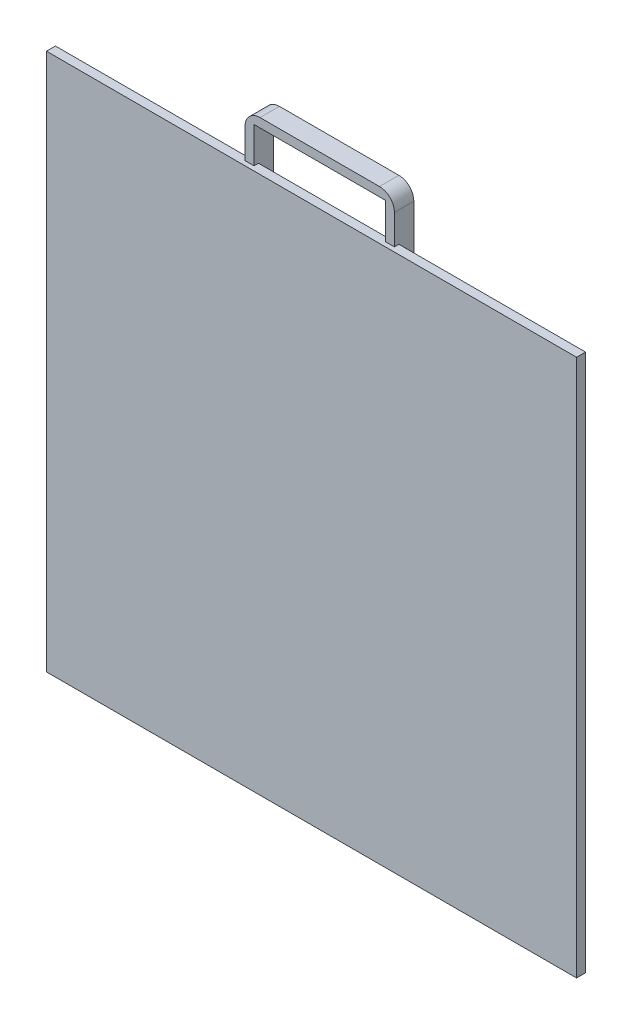
ISO-10303-21;
HEADER;
FILE_DESCRIPTION(('STEP AP214'),'2;1');
FILE_NAME('part.step','',(''),(''),'','','');
FILE_SCHEMA(('AUTOMOTIVE_DESIGN { 1 0 10303 214 1 1 1 1 }'));
ENDSEC;
DATA;
#1=APPLICATION_CONTEXT('core data for automotive mechanical design processes');
#2=APPLICATION_PROTOCOL_DEFINITION('international standard','automotive_design',2000,#1);
#3=PRODUCT_CONTEXT('',#1,'mechanical');
#4=PRODUCT('Part','Part','',(#3));
#5=PRODUCT_RELATED_PRODUCT_CATEGORY('part','',(#4));
#6=PRODUCT_DEFINITION_FORMATION('','',#4);
#7=PRODUCT_DEFINITION_CONTEXT('part definition',#1,'design');
#8=PRODUCT_DEFINITION('design','',#6,#7);
#9=PRODUCT_DEFINITION_SHAPE('','',#8);
#10=(LENGTH_UNIT() NAMED_UNIT(*) SI_UNIT(.MILLI.,.METRE.));
#11=(NAMED_UNIT(*) PLANE_ANGLE_UNIT() SI_UNIT($,.RADIAN.));
#12=(NAMED_UNIT(*) SI_UNIT($,.STERADIAN.) SOLID_ANGLE_UNIT());
#13=UNCERTAINTY_MEASURE_WITH_UNIT(LENGTH_MEASURE(1.E-05),#10,'distance_accuracy_value','');
#14=(GEOMETRIC_REPRESENTATION_CONTEXT(3) GLOBAL_UNCERTAINTY_ASSIGNED_CONTEXT((#13)) GLOBAL_UNIT_ASSIGNED_CONTEXT((#10,
#11,#12)) REPRESENTATION_CONTEXT('',''));
#15=CARTESIAN_POINT('',(0.,0.,0.));
#16=DIRECTION('',(0.,0.,1.));
#17=DIRECTION('',(1.,0.,0.));
#18=AXIS2_PLACEMENT_3D('',#15,#16,#17);
#19=CARTESIAN_POINT('',(0.,165.,-8.));
#20=DIRECTION('',(0.,1.,0.));
#21=DIRECTION('',(0.,0.,1.));
#22=AXIS2_PLACEMENT_3D('',#19,#20,#21);
#23=PLANE('',#22);
#24=DIRECTION('',(-1.,0.,0.));
#25=VECTOR('',#24,1.);
#26=CARTESIAN_POINT('',(0.,165.,-8.));
#27=LINE('',#26,#25);
#28=CARTESIAN_POINT('',(67.9999999999999,165.,-8.));
#29=VERTEX_POINT('',#28);
#30=CARTESIAN_POINT('',(65.,165.,-8.));
#31=VERTEX_POINT('',#30);
#32=EDGE_CURVE('E211',#29,#31,#27,.T.);
#33=ORIENTED_EDGE('',*,*,#32,.F.);
#34=DIRECTION('',(0.,0.,-1.));
#35=VECTOR('',#34,1.);
#36=CARTESIAN_POINT('',(67.9999999999999,165.,48.6236379965612));
#37=LINE('',#36,#35);
#38=CARTESIAN_POINT('',(67.9999999999999,165.,-3.));
#39=VERTEX_POINT('',#38);
#40=EDGE_CURVE('E197',#39,#29,#37,.T.);
#41=ORIENTED_EDGE('',*,*,#40,.F.);
#42=DIRECTION('',(1.,0.,0.));
#43=VECTOR('',#42,1.);
#44=CARTESIAN_POINT('',(0.,165.,-3.));
#45=LINE('',#44,#43);
#46=CARTESIAN_POINT('',(65.,165.,-3.));
#47=VERTEX_POINT('',#46);
#48=EDGE_CURVE('E272',#47,#39,#45,.T.);
#49=ORIENTED_EDGE('',*,*,#48,.F.);
#50=DIRECTION('',(0.,0.,1.));
#51=VECTOR('',#50,1.);
#52=CARTESIAN_POINT('',(65.,165.,-8.));
#53=LINE('',#52,#51);
#54=EDGE_CURVE('E222',#31,#47,#53,.T.);
#55=ORIENTED_EDGE('',*,*,#54,.F.);
#56=EDGE_LOOP('',(#33,#41,#49,#55));
#57=FACE_BOUND('',#56,.T.);
#58=ADVANCED_FACE('F34',(#57),#23,.F.);
#59=CARTESIAN_POINT('',(0.,180.,-3.));
#60=DIRECTION('',(0.,1.,0.));
#61=DIRECTION('',(0.,0.,1.));
#62=AXIS2_PLACEMENT_3D('',#59,#60,#61);
#63=PLANE('',#62);
#64=DIRECTION('',(1.,0.,0.));
#65=VECTOR('',#64,1.);
#66=CARTESIAN_POINT('',(0.,180.,-1.5));
#67=LINE('',#66,#65);
#68=CARTESIAN_POINT('',(65.,180.,-1.5));
#69=VERTEX_POINT('',#68);
#70=CARTESIAN_POINT('',(68.,180.,-1.5));
#71=VERTEX_POINT('',#70);
#72=EDGE_CURVE('E182',#69,#71,#67,.T.);
#73=ORIENTED_EDGE('',*,*,#72,.F.);
#74=DIRECTION('',(0.,0.,-1.));
#75=VECTOR('',#74,1.);
#76=CARTESIAN_POINT('',(65.,180.,-3.));
#77=LINE('',#76,#75);
#78=CARTESIAN_POINT('',(65.,180.,-3.));
#79=VERTEX_POINT('',#78);
#80=EDGE_CURVE('E235',#69,#79,#77,.T.);
#81=ORIENTED_EDGE('',*,*,#80,.T.);
#82=DIRECTION('',(-1.,0.,0.));
#83=VECTOR('',#82,1.);
#84=CARTESIAN_POINT('',(0.,180.,-3.));
#85=LINE('',#84,#83);
#86=CARTESIAN_POINT('',(0.,180.,-3.));
#87=VERTEX_POINT('',#86);
#88=EDGE_CURVE('E249',#79,#87,#85,.T.);
#89=ORIENTED_EDGE('',*,*,#88,.T.);
#90=DIRECTION('',(0.,0.,1.));
#91=VECTOR('',#90,1.);
#92=CARTESIAN_POINT('',(0.,180.,-3.));
#93=LINE('',#92,#91);
#94=CARTESIAN_POINT('',(0.,180.,0.));
#95=VERTEX_POINT('',#94);
#96=EDGE_CURVE('E264',#87,#95,#93,.T.);
#97=ORIENTED_EDGE('',*,*,#96,.T.);
#98=DIRECTION('',(-1.,0.,0.));
#99=VECTOR('',#98,1.);
#100=CARTESIAN_POINT('',(0.,180.,0.));
#101=LINE('',#100,#99);
#102=CARTESIAN_POINT('',(177.5,180.,0.));
#103=VERTEX_POINT('',#102);
#104=EDGE_CURVE('E243',#103,#95,#101,.T.);
#105=ORIENTED_EDGE('',*,*,#104,.F.);
#106=DIRECTION('',(0.,0.,1.));
#107=VECTOR('',#106,1.);
#108=CARTESIAN_POINT('',(177.5,180.,-3.));
#109=LINE('',#108,#107);
#110=CARTESIAN_POINT('',(177.5,180.,-3.));
#111=VERTEX_POINT('',#110);
#112=EDGE_CURVE('E267',#111,#103,#109,.T.);
#113=ORIENTED_EDGE('',*,*,#112,.F.);
#114=CARTESIAN_POINT('',(115.,180.,-3.));
#115=VERTEX_POINT('',#114);
#116=EDGE_CURVE('E250',#111,#115,#85,.T.);
#117=ORIENTED_EDGE('',*,*,#116,.T.);
#118=DIRECTION('',(0.,0.,-1.));
#119=VECTOR('',#118,1.);
#120=CARTESIAN_POINT('',(115.,180.,-3.));
#121=LINE('',#120,#119);
#122=CARTESIAN_POINT('',(115.,180.,-1.5));
#123=VERTEX_POINT('',#122);
#124=EDGE_CURVE('E231',#123,#115,#121,.T.);
#125=ORIENTED_EDGE('',*,*,#124,.F.);
#126=CARTESIAN_POINT('',(112.,180.,-1.5));
#127=VERTEX_POINT('',#126);
#128=EDGE_CURVE('E281',#127,#123,#67,.T.);
#129=ORIENTED_EDGE('',*,*,#128,.F.);
#130=DIRECTION('',(0.,0.,1.));
#131=VECTOR('',#130,1.);
#132=CARTESIAN_POINT('',(112.,180.,-8.));
#133=LINE('',#132,#131);
#134=CARTESIAN_POINT('',(112.,180.,-3.));
#135=VERTEX_POINT('',#134);
#136=EDGE_CURVE('E185',#135,#127,#133,.T.);
#137=ORIENTED_EDGE('',*,*,#136,.F.);
#138=DIRECTION('',(-1.,0.,0.));
#139=VECTOR('',#138,1.);
#140=CARTESIAN_POINT('',(0.,180.,-3.));
#141=LINE('',#140,#139);
#142=CARTESIAN_POINT('',(68.,180.,-3.));
#143=VERTEX_POINT('',#142);
#144=EDGE_CURVE('E189',#135,#143,#141,.T.);
#145=ORIENTED_EDGE('',*,*,#144,.T.);
#146=DIRECTION('',(0.,0.,1.));
#147=VECTOR('',#146,1.);
#148=CARTESIAN_POINT('',(68.,180.,-8.));
#149=LINE('',#148,#147);
#150=EDGE_CURVE('E183',#143,#71,#149,.T.);
#151=ORIENTED_EDGE('',*,*,#150,.T.);
#152=EDGE_LOOP('',(#73,#81,#89,#97,#105,#113,#117,#125,#129,#137,#145,#151));
#153=FACE_BOUND('',#152,.T.);
#154=ADVANCED_FACE('F321',(#153),#63,.T.);
#155=CARTESIAN_POINT('',(0.,0.,-3.));
#156=DIRECTION('',(0.,0.,-1.));
#157=DIRECTION('',(-1.,0.,0.));
#158=AXIS2_PLACEMENT_3D('',#155,#156,#157);
#159=PLANE('',#158);
#160=ORIENTED_EDGE('',*,*,#144,.F.);
#161=DIRECTION('',(0.,1.,0.));
#162=VECTOR('',#161,1.);
#163=CARTESIAN_POINT('',(112.,168.,-3.));
#164=LINE('',#163,#162);
#165=CARTESIAN_POINT('',(112.,165.,-3.));
#166=VERTEX_POINT('',#165);
#167=EDGE_CURVE('E193',#166,#135,#164,.T.);
#168=ORIENTED_EDGE('',*,*,#167,.F.);
#169=CARTESIAN_POINT('',(115.,165.,-3.));
#170=VERTEX_POINT('',#169);
#171=EDGE_CURVE('E266',#166,#170,#45,.T.);
#172=ORIENTED_EDGE('',*,*,#171,.T.);
#173=DIRECTION('',(0.,-1.,0.));
#174=VECTOR('',#173,1.);
#175=CARTESIAN_POINT('',(115.,0.,-3.));
#176=LINE('',#175,#174);
#177=EDGE_CURVE('E275',#115,#170,#176,.T.);
#178=ORIENTED_EDGE('',*,*,#177,.F.);
#179=ORIENTED_EDGE('',*,*,#116,.F.);
#180=DIRECTION('',(0.,1.,0.));
#181=VECTOR('',#180,1.);
#182=CARTESIAN_POINT('',(177.5,0.,-3.));
#183=LINE('',#182,#181);
#184=CARTESIAN_POINT('',(177.5,0.,-3.));
#185=VERTEX_POINT('',#184);
#186=EDGE_CURVE('E246',#185,#111,#183,.T.);
#187=ORIENTED_EDGE('',*,*,#186,.F.);
#188=DIRECTION('',(1.,0.,0.));
#189=VECTOR('',#188,1.);
#190=CARTESIAN_POINT('',(0.,0.,-3.));
#191=LINE('',#190,#189);
#192=CARTESIAN_POINT('',(0.,0.,-3.));
#193=VERTEX_POINT('',#192);
#194=EDGE_CURVE('E242',#193,#185,#191,.T.);
#195=ORIENTED_EDGE('',*,*,#194,.F.);
#196=DIRECTION('',(0.,-1.,0.));
#197=VECTOR('',#196,1.);
#198=CARTESIAN_POINT('',(0.,0.,-3.));
#199=LINE('',#198,#197);
#200=EDGE_CURVE('E239',#87,#193,#199,.T.);
#201=ORIENTED_EDGE('',*,*,#200,.F.);
#202=ORIENTED_EDGE('',*,*,#88,.F.);
#203=DIRECTION('',(0.,-1.,0.));
#204=VECTOR('',#203,1.);
#205=CARTESIAN_POINT('',(65.,0.,-3.));
#206=LINE('',#205,#204);
#207=EDGE_CURVE('E278',#79,#47,#206,.T.);
#208=ORIENTED_EDGE('',*,*,#207,.T.);
#209=ORIENTED_EDGE('',*,*,#48,.T.);
#210=DIRECTION('',(0.,-1.,0.));
#211=VECTOR('',#210,1.);
#212=CARTESIAN_POINT('',(67.9999999999999,168.,-3.));
#213=LINE('',#212,#211);
#214=EDGE_CURVE('E196',#143,#39,#213,.T.);
#215=ORIENTED_EDGE('',*,*,#214,.F.);
#216=EDGE_LOOP('',(#160,#168,#172,#178,#179,#187,#195,#201,#202,#208,#209,#215));
#217=FACE_BOUND('',#216,.T.);
#218=ADVANCED_FACE('F328',(#217),#159,.T.);
#219=CARTESIAN_POINT('',(0.,0.,-3.));
#220=DIRECTION('',(-1.,0.,0.));
#221=DIRECTION('',(0.,0.,1.));
#222=AXIS2_PLACEMENT_3D('',#219,#220,#221);
#223=PLANE('',#222);
#224=DIRECTION('',(0.,-1.,0.));
#225=VECTOR('',#224,1.);
#226=CARTESIAN_POINT('',(0.,0.,0.));
#227=LINE('',#226,#225);
#228=CARTESIAN_POINT('',(0.,0.,0.));
#229=VERTEX_POINT('',#228);
#230=EDGE_CURVE('E238',#95,#229,#227,.T.);
#231=ORIENTED_EDGE('',*,*,#230,.F.);
#232=ORIENTED_EDGE('',*,*,#96,.F.);
#233=ORIENTED_EDGE('',*,*,#200,.T.);
#234=DIRECTION('',(0.,0.,1.));
#235=VECTOR('',#234,1.);
#236=CARTESIAN_POINT('',(0.,0.,-3.));
#237=LINE('',#236,#235);
#238=EDGE_CURVE('E253',#193,#229,#237,.T.);
#239=ORIENTED_EDGE('',*,*,#238,.T.);
#240=EDGE_LOOP('',(#231,#232,#233,#239));
#241=FACE_BOUND('',#240,.T.);
#242=ADVANCED_FACE('F365',(#241),#223,.T.);
#243=CARTESIAN_POINT('',(177.5,0.,-3.));
#244=DIRECTION('',(1.,0.,0.));
#245=DIRECTION('',(0.,0.,-1.));
#246=AXIS2_PLACEMENT_3D('',#243,#244,#245);
#247=PLANE('',#246);
#248=DIRECTION('',(0.,1.,0.));
#249=VECTOR('',#248,1.);
#250=CARTESIAN_POINT('',(177.5,0.,0.));
#251=LINE('',#250,#249);
#252=CARTESIAN_POINT('',(177.5,0.,0.));
#253=VERTEX_POINT('',#252);
#254=EDGE_CURVE('E259',#253,#103,#251,.T.);
#255=ORIENTED_EDGE('',*,*,#254,.F.);
#256=DIRECTION('',(0.,0.,1.));
#257=VECTOR('',#256,1.);
#258=CARTESIAN_POINT('',(177.5,0.,-3.));
#259=LINE('',#258,#257);
#260=EDGE_CURVE('E269',#185,#253,#259,.T.);
#261=ORIENTED_EDGE('',*,*,#260,.F.);
#262=ORIENTED_EDGE('',*,*,#186,.T.);
#263=ORIENTED_EDGE('',*,*,#112,.T.);
#264=EDGE_LOOP('',(#255,#261,#262,#263));
#265=FACE_BOUND('',#264,.T.);
#266=ADVANCED_FACE('F367',(#265),#247,.T.);
#267=CARTESIAN_POINT('',(0.,0.,-3.));
#268=DIRECTION('',(0.,-1.,0.));
#269=DIRECTION('',(0.,0.,-1.));
#270=AXIS2_PLACEMENT_3D('',#267,#268,#269);
#271=PLANE('',#270);
#272=DIRECTION('',(1.,0.,0.));
#273=VECTOR('',#272,1.);
#274=CARTESIAN_POINT('',(0.,0.,0.));
#275=LINE('',#274,#273);
#276=EDGE_CURVE('E256',#229,#253,#275,.T.);
#277=ORIENTED_EDGE('',*,*,#276,.F.);
#278=ORIENTED_EDGE('',*,*,#238,.F.);
#279=ORIENTED_EDGE('',*,*,#194,.T.);
#280=ORIENTED_EDGE('',*,*,#260,.T.);
#281=EDGE_LOOP('',(#277,#278,#279,#280));
#282=FACE_BOUND('',#281,.T.);
#283=ADVANCED_FACE('F360',(#282),#271,.T.);
#284=CARTESIAN_POINT('',(0.,0.,0.));
#285=DIRECTION('',(0.,0.,-1.));
#286=DIRECTION('',(-1.,0.,0.));
#287=AXIS2_PLACEMENT_3D('',#284,#285,#286);
#288=PLANE('',#287);
#289=ORIENTED_EDGE('',*,*,#230,.T.);
#290=ORIENTED_EDGE('',*,*,#276,.T.);
#291=ORIENTED_EDGE('',*,*,#254,.T.);
#292=ORIENTED_EDGE('',*,*,#104,.T.);
#293=EDGE_LOOP('',(#289,#290,#291,#292));
#294=FACE_BOUND('',#293,.T.);
#295=ADVANCED_FACE('F354',(#294),#288,.F.);
#296=CARTESIAN_POINT('',(65.,0.,-8.));
#297=DIRECTION('',(1.,0.,0.));
#298=DIRECTION('',(0.,0.,-1.));
#299=AXIS2_PLACEMENT_3D('',#296,#297,#298);
#300=PLANE('',#299);
#301=DIRECTION('',(0.,1.,0.));
#302=VECTOR('',#301,1.);
#303=CARTESIAN_POINT('',(65.,0.,-1.5));
#304=LINE('',#303,#302);
#305=CARTESIAN_POINT('',(65.,190.,-1.5));
#306=VERTEX_POINT('',#305);
#307=EDGE_CURVE('E199',#69,#306,#304,.T.);
#308=ORIENTED_EDGE('',*,*,#307,.T.);
#309=DIRECTION('',(0.,0.,1.));
#310=VECTOR('',#309,1.);
#311=CARTESIAN_POINT('',(65.,190.,-8.));
#312=LINE('',#311,#310);
#313=CARTESIAN_POINT('',(65.,190.,-8.));
#314=VERTEX_POINT('',#313);
#315=EDGE_CURVE('E42',#306,#314,#312,.F.);
#316=ORIENTED_EDGE('',*,*,#315,.T.);
#317=DIRECTION('',(0.,1.,0.));
#318=VECTOR('',#317,1.);
#319=CARTESIAN_POINT('',(65.,0.,-8.));
#320=LINE('',#319,#318);
#321=EDGE_CURVE('E209',#31,#314,#320,.T.);
#322=ORIENTED_EDGE('',*,*,#321,.F.);
#323=ORIENTED_EDGE('',*,*,#54,.T.);
#324=ORIENTED_EDGE('',*,*,#207,.F.);
#325=ORIENTED_EDGE('',*,*,#80,.F.);
#326=EDGE_LOOP('',(#308,#316,#322,#323,#324,#325));
#327=FACE_BOUND('',#326,.T.);
#328=ADVANCED_FACE('F352',(#327),#300,.F.);
#329=CARTESIAN_POINT('',(0.,195.,-8.));
#330=DIRECTION('',(0.,1.,0.));
#331=DIRECTION('',(0.,0.,1.));
#332=AXIS2_PLACEMENT_3D('',#329,#330,#331);
#333=PLANE('',#332);
#334=DIRECTION('',(-1.,0.,0.));
#335=VECTOR('',#334,1.);
#336=CARTESIAN_POINT('',(0.,195.,-8.));
#337=LINE('',#336,#335);
#338=CARTESIAN_POINT('',(110.,195.,-8.));
#339=VERTEX_POINT('',#338);
#340=CARTESIAN_POINT('',(70.,195.,-8.));
#341=VERTEX_POINT('',#340);
#342=EDGE_CURVE('E219',#339,#341,#337,.T.);
#343=ORIENTED_EDGE('',*,*,#342,.T.);
#344=DIRECTION('',(0.,0.,1.));
#345=VECTOR('',#344,1.);
#346=CARTESIAN_POINT('',(70.,195.,-1.5));
#347=LINE('',#346,#345);
#348=CARTESIAN_POINT('',(70.,195.,-1.5));
#349=VERTEX_POINT('',#348);
#350=EDGE_CURVE('E292',#341,#349,#347,.T.);
#351=ORIENTED_EDGE('',*,*,#350,.T.);
#352=DIRECTION('',(-1.,0.,0.));
#353=VECTOR('',#352,1.);
#354=CARTESIAN_POINT('',(0.,195.,-1.5));
#355=LINE('',#354,#353);
#356=CARTESIAN_POINT('',(110.,195.,-1.5));
#357=VERTEX_POINT('',#356);
#358=EDGE_CURVE('E212',#357,#349,#355,.T.);
#359=ORIENTED_EDGE('',*,*,#358,.F.);
#360=DIRECTION('',(0.,0.,1.));
#361=VECTOR('',#360,1.);
#362=CARTESIAN_POINT('',(110.,195.,-8.));
#363=LINE('',#362,#361);
#364=EDGE_CURVE('E288',#357,#339,#363,.F.);
#365=ORIENTED_EDGE('',*,*,#364,.T.);
#366=EDGE_LOOP('',(#343,#351,#359,#365));
#367=FACE_BOUND('',#366,.T.);
#368=ADVANCED_FACE('F298',(#367),#333,.T.);
#369=CARTESIAN_POINT('',(115.,0.,-8.));
#370=DIRECTION('',(1.,0.,0.));
#371=DIRECTION('',(0.,0.,-1.));
#372=AXIS2_PLACEMENT_3D('',#369,#370,#371);
#373=PLANE('',#372);
#374=DIRECTION('',(0.,1.,0.));
#375=VECTOR('',#374,1.);
#376=CARTESIAN_POINT('',(115.,0.,-8.));
#377=LINE('',#376,#375);
#378=CARTESIAN_POINT('',(115.,165.,-8.));
#379=VERTEX_POINT('',#378);
#380=CARTESIAN_POINT('',(115.,190.,-8.));
#381=VERTEX_POINT('',#380);
#382=EDGE_CURVE('E216',#379,#381,#377,.T.);
#383=ORIENTED_EDGE('',*,*,#382,.T.);
#384=DIRECTION('',(0.,0.,1.));
#385=VECTOR('',#384,1.);
#386=CARTESIAN_POINT('',(115.,190.,-8.));
#387=LINE('',#386,#385);
#388=CARTESIAN_POINT('',(115.,190.,-1.5));
#389=VERTEX_POINT('',#388);
#390=EDGE_CURVE('E283',#381,#389,#387,.T.);
#391=ORIENTED_EDGE('',*,*,#390,.T.);
#392=DIRECTION('',(0.,1.,0.));
#393=VECTOR('',#392,1.);
#394=CARTESIAN_POINT('',(115.,0.,-1.5));
#395=LINE('',#394,#393);
#396=EDGE_CURVE('E224',#123,#389,#395,.T.);
#397=ORIENTED_EDGE('',*,*,#396,.F.);
#398=ORIENTED_EDGE('',*,*,#124,.T.);
#399=ORIENTED_EDGE('',*,*,#177,.T.);
#400=DIRECTION('',(0.,0.,1.));
#401=VECTOR('',#400,1.);
#402=CARTESIAN_POINT('',(115.,165.,-8.));
#403=LINE('',#402,#401);
#404=EDGE_CURVE('E228',#379,#170,#403,.T.);
#405=ORIENTED_EDGE('',*,*,#404,.F.);
#406=EDGE_LOOP('',(#383,#391,#397,#398,#399,#405));
#407=FACE_BOUND('',#406,.T.);
#408=ADVANCED_FACE('F309',(#407),#373,.T.);
#409=ORIENTED_EDGE('',*,*,#171,.F.);
#410=DIRECTION('',(0.,0.,-1.));
#411=VECTOR('',#410,1.);
#412=CARTESIAN_POINT('',(112.,165.,48.6236379965612));
#413=LINE('',#412,#411);
#414=CARTESIAN_POINT('',(112.,165.,-8.));
#415=VERTEX_POINT('',#414);
#416=EDGE_CURVE('E205',#166,#415,#413,.T.);
#417=ORIENTED_EDGE('',*,*,#416,.T.);
#418=EDGE_CURVE('E213',#379,#415,#27,.T.);
#419=ORIENTED_EDGE('',*,*,#418,.F.);
#420=ORIENTED_EDGE('',*,*,#404,.T.);
#421=EDGE_LOOP('',(#409,#417,#419,#420));
#422=FACE_BOUND('',#421,.T.);
#423=ADVANCED_FACE('F324',(#422),#23,.F.);
#424=CARTESIAN_POINT('',(0.,0.,-8.));
#425=DIRECTION('',(0.,0.,1.));
#426=DIRECTION('',(1.,0.,0.));
#427=AXIS2_PLACEMENT_3D('',#424,#425,#426);
#428=PLANE('',#427);
#429=ORIENTED_EDGE('',*,*,#321,.T.);
#430=CARTESIAN_POINT('',(70.,190.,-8.));
#431=DIRECTION('',(0.,0.,1.));
#432=DIRECTION('',(1.,0.,0.));
#433=AXIS2_PLACEMENT_3D('',#430,#431,#432);
#434=CIRCLE('',#433,5.);
#435=EDGE_CURVE('E11',#314,#341,#434,.F.);
#436=ORIENTED_EDGE('',*,*,#435,.T.);
#437=ORIENTED_EDGE('',*,*,#342,.F.);
#438=CARTESIAN_POINT('',(110.,190.,-8.));
#439=DIRECTION('',(0.,0.,1.));
#440=DIRECTION('',(1.,0.,0.));
#441=AXIS2_PLACEMENT_3D('',#438,#439,#440);
#442=CIRCLE('',#441,5.);
#443=EDGE_CURVE('E290',#339,#381,#442,.F.);
#444=ORIENTED_EDGE('',*,*,#443,.T.);
#445=ORIENTED_EDGE('',*,*,#382,.F.);
#446=ORIENTED_EDGE('',*,*,#418,.T.);
#447=DIRECTION('',(0.,-1.,0.));
#448=VECTOR('',#447,1.);
#449=CARTESIAN_POINT('',(112.,168.,-8.));
#450=LINE('',#449,#448);
#451=CARTESIAN_POINT('',(112.,192.,-8.));
#452=VERTEX_POINT('',#451);
#453=EDGE_CURVE('E201',#452,#415,#450,.T.);
#454=ORIENTED_EDGE('',*,*,#453,.F.);
#455=DIRECTION('',(1.,0.,0.));
#456=VECTOR('',#455,1.);
#457=CARTESIAN_POINT('',(112.,192.,-8.));
#458=LINE('',#457,#456);
#459=CARTESIAN_POINT('',(67.9999999999999,192.,-8.));
#460=VERTEX_POINT('',#459);
#461=EDGE_CURVE('E192',#460,#452,#458,.T.);
#462=ORIENTED_EDGE('',*,*,#461,.F.);
#463=DIRECTION('',(0.,1.,0.));
#464=VECTOR('',#463,1.);
#465=CARTESIAN_POINT('',(67.9999999999999,168.,-8.));
#466=LINE('',#465,#464);
#467=EDGE_CURVE('E167',#29,#460,#466,.T.);
#468=ORIENTED_EDGE('',*,*,#467,.F.);
#469=ORIENTED_EDGE('',*,*,#32,.T.);
#470=EDGE_LOOP('',(#429,#436,#437,#444,#445,#446,#454,#462,#468,#469));
#471=FACE_BOUND('',#470,.T.);
#472=ADVANCED_FACE('F314',(#471),#428,.F.);
#473=CARTESIAN_POINT('',(0.,0.,-1.5));
#474=DIRECTION('',(0.,0.,1.));
#475=DIRECTION('',(1.,0.,0.));
#476=AXIS2_PLACEMENT_3D('',#473,#474,#475);
#477=PLANE('',#476);
#478=ORIENTED_EDGE('',*,*,#358,.T.);
#479=CARTESIAN_POINT('',(70.,190.,-1.5));
#480=DIRECTION('',(0.,0.,1.));
#481=DIRECTION('',(1.,0.,0.));
#482=AXIS2_PLACEMENT_3D('',#479,#480,#481);
#483=CIRCLE('',#482,5.);
#484=EDGE_CURVE('E56',#349,#306,#483,.T.);
#485=ORIENTED_EDGE('',*,*,#484,.T.);
#486=ORIENTED_EDGE('',*,*,#307,.F.);
#487=ORIENTED_EDGE('',*,*,#72,.T.);
#488=DIRECTION('',(0.,-1.,0.));
#489=VECTOR('',#488,1.);
#490=CARTESIAN_POINT('',(68.,192.,-1.5));
#491=LINE('',#490,#489);
#492=CARTESIAN_POINT('',(68.,192.,-1.5));
#493=VERTEX_POINT('',#492);
#494=EDGE_CURVE('E164',#493,#71,#491,.T.);
#495=ORIENTED_EDGE('',*,*,#494,.F.);
#496=DIRECTION('',(-1.,0.,0.));
#497=VECTOR('',#496,1.);
#498=CARTESIAN_POINT('',(68.,192.,-1.5));
#499=LINE('',#498,#497);
#500=CARTESIAN_POINT('',(112.,192.,-1.5));
#501=VERTEX_POINT('',#500);
#502=EDGE_CURVE('E174',#501,#493,#499,.T.);
#503=ORIENTED_EDGE('',*,*,#502,.F.);
#504=DIRECTION('',(0.,1.,0.));
#505=VECTOR('',#504,1.);
#506=CARTESIAN_POINT('',(112.,180.,-1.5));
#507=LINE('',#506,#505);
#508=EDGE_CURVE('E178',#127,#501,#507,.T.);
#509=ORIENTED_EDGE('',*,*,#508,.F.);
#510=ORIENTED_EDGE('',*,*,#128,.T.);
#511=ORIENTED_EDGE('',*,*,#396,.T.);
#512=CARTESIAN_POINT('',(110.,190.,-1.5));
#513=DIRECTION('',(0.,0.,1.));
#514=DIRECTION('',(1.,0.,0.));
#515=AXIS2_PLACEMENT_3D('',#512,#513,#514);
#516=CIRCLE('',#515,5.);
#517=EDGE_CURVE('E286',#389,#357,#516,.T.);
#518=ORIENTED_EDGE('',*,*,#517,.T.);
#519=EDGE_LOOP('',(#478,#485,#486,#487,#495,#503,#509,#510,#511,#518));
#520=FACE_BOUND('',#519,.T.);
#521=ADVANCED_FACE('F180',(#520),#477,.T.);
#522=CARTESIAN_POINT('',(67.9999999999999,168.,48.6236379965612));
#523=DIRECTION('',(-1.,0.,0.));
#524=DIRECTION('',(0.,0.,1.));
#525=AXIS2_PLACEMENT_3D('',#522,#523,#524);
#526=PLANE('',#525);
#527=ORIENTED_EDGE('',*,*,#467,.T.);
#528=DIRECTION('',(0.,0.,-1.));
#529=VECTOR('',#528,1.);
#530=CARTESIAN_POINT('',(67.9999999999999,192.,48.6236379965612));
#531=LINE('',#530,#529);
#532=EDGE_CURVE('E159',#493,#460,#531,.T.);
#533=ORIENTED_EDGE('',*,*,#532,.F.);
#534=ORIENTED_EDGE('',*,*,#494,.T.);
#535=ORIENTED_EDGE('',*,*,#150,.F.);
#536=ORIENTED_EDGE('',*,*,#214,.T.);
#537=ORIENTED_EDGE('',*,*,#40,.T.);
#538=EDGE_LOOP('',(#527,#533,#534,#535,#536,#537));
#539=FACE_BOUND('',#538,.T.);
#540=ADVANCED_FACE('F161',(#539),#526,.F.);
#541=CARTESIAN_POINT('',(112.,168.,48.6236379965612));
#542=DIRECTION('',(1.,0.,0.));
#543=DIRECTION('',(0.,0.,-1.));
#544=AXIS2_PLACEMENT_3D('',#541,#542,#543);
#545=PLANE('',#544);
#546=ORIENTED_EDGE('',*,*,#167,.T.);
#547=ORIENTED_EDGE('',*,*,#136,.T.);
#548=ORIENTED_EDGE('',*,*,#508,.T.);
#549=DIRECTION('',(0.,0.,-1.));
#550=VECTOR('',#549,1.);
#551=CARTESIAN_POINT('',(112.,192.,48.6236379965612));
#552=LINE('',#551,#550);
#553=EDGE_CURVE('E171',#501,#452,#552,.T.);
#554=ORIENTED_EDGE('',*,*,#553,.T.);
#555=ORIENTED_EDGE('',*,*,#453,.T.);
#556=ORIENTED_EDGE('',*,*,#416,.F.);
#557=EDGE_LOOP('',(#546,#547,#548,#554,#555,#556));
#558=FACE_BOUND('',#557,.T.);
#559=ADVANCED_FACE('F349',(#558),#545,.F.);
#560=CARTESIAN_POINT('',(112.,192.,48.6236379965612));
#561=DIRECTION('',(0.,1.,0.));
#562=DIRECTION('',(0.,0.,1.));
#563=AXIS2_PLACEMENT_3D('',#560,#561,#562);
#564=PLANE('',#563);
#565=ORIENTED_EDGE('',*,*,#553,.F.);
#566=ORIENTED_EDGE('',*,*,#502,.T.);
#567=ORIENTED_EDGE('',*,*,#532,.T.);
#568=ORIENTED_EDGE('',*,*,#461,.T.);
#569=EDGE_LOOP('',(#565,#566,#567,#568));
#570=FACE_BOUND('',#569,.T.);
#571=ADVANCED_FACE('F175',(#570),#564,.F.);
#572=CARTESIAN_POINT('',(110.,190.,-8.));
#573=DIRECTION('',(0.,0.,1.));
#574=DIRECTION('',(1.,0.,0.));
#575=AXIS2_PLACEMENT_3D('',#572,#573,#574);
#576=CYLINDRICAL_SURFACE('',#575,5.);
#577=ORIENTED_EDGE('',*,*,#443,.F.);
#578=ORIENTED_EDGE('',*,*,#364,.F.);
#579=ORIENTED_EDGE('',*,*,#517,.F.);
#580=ORIENTED_EDGE('',*,*,#390,.F.);
#581=EDGE_LOOP('',(#577,#578,#579,#580));
#582=FACE_BOUND('',#581,.T.);
#583=ADVANCED_FACE('F307',(#582),#576,.T.);
#584=CARTESIAN_POINT('',(70.,190.,-8.));
#585=DIRECTION('',(0.,0.,-1.));
#586=DIRECTION('',(-1.,0.,0.));
#587=AXIS2_PLACEMENT_3D('',#584,#585,#586);
#588=CYLINDRICAL_SURFACE('',#587,5.);
#589=ORIENTED_EDGE('',*,*,#435,.F.);
#590=ORIENTED_EDGE('',*,*,#315,.F.);
#591=ORIENTED_EDGE('',*,*,#484,.F.);
#592=ORIENTED_EDGE('',*,*,#350,.F.);
#593=EDGE_LOOP('',(#589,#590,#591,#592));
#594=FACE_BOUND('',#593,.T.);
#595=ADVANCED_FACE('F36',(#594),#588,.T.);
#596=CLOSED_SHELL('',(#58,#154,#218,#242,#266,#283,#295,#328,#368,#408,#423,#472,#521,#540,#559,
#571,#583,#595));
#597=MANIFOLD_SOLID_BREP('B2',#596);
#598=ADVANCED_BREP_SHAPE_REPRESENTATION('',(#18,#597),#14);
#599=SHAPE_DEFINITION_REPRESENTATION(#9,#598);
ENDSEC;
END-ISO-10303-21;
